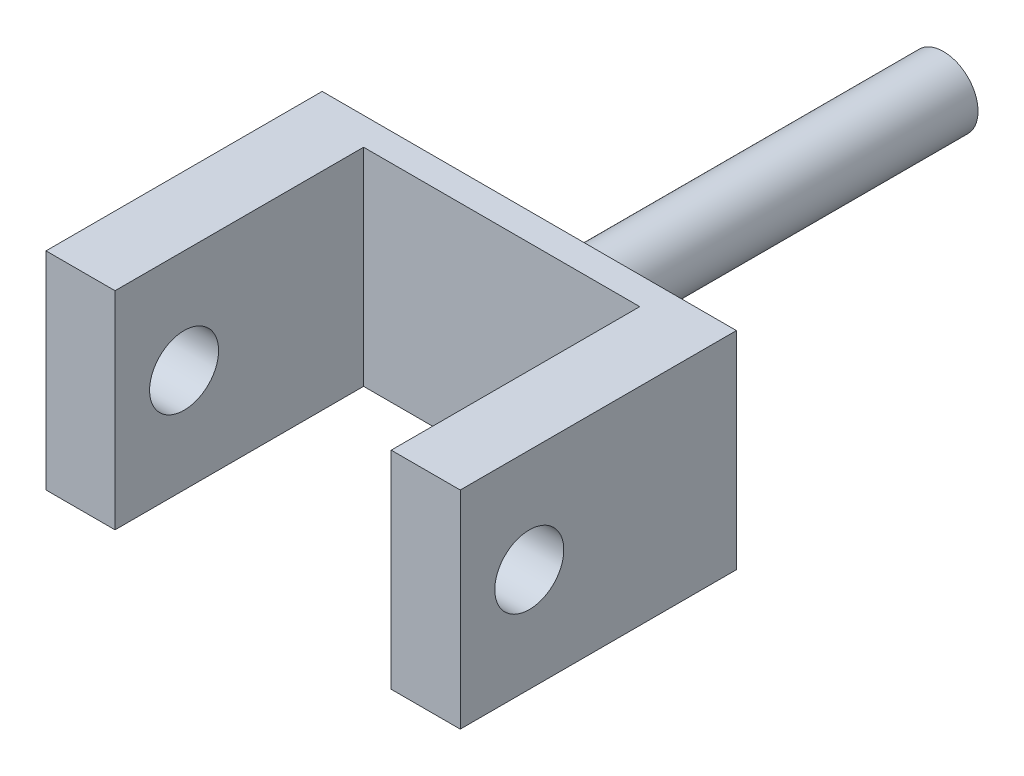
ISO-10303-21;
HEADER;
FILE_DESCRIPTION(('STEP AP214'),'2;1');
FILE_NAME('part.step','',(''),(''),'','','');
FILE_SCHEMA(('AUTOMOTIVE_DESIGN { 1 0 10303 214 1 1 1 1 }'));
ENDSEC;
DATA;
#1=APPLICATION_CONTEXT('core data for automotive mechanical design processes');
#2=APPLICATION_PROTOCOL_DEFINITION('international standard','automotive_design',2000,#1);
#3=PRODUCT_CONTEXT('',#1,'mechanical');
#4=PRODUCT('Part','Part','',(#3));
#5=PRODUCT_RELATED_PRODUCT_CATEGORY('part','',(#4));
#6=PRODUCT_DEFINITION_FORMATION('','',#4);
#7=PRODUCT_DEFINITION_CONTEXT('part definition',#1,'design');
#8=PRODUCT_DEFINITION('design','',#6,#7);
#9=PRODUCT_DEFINITION_SHAPE('','',#8);
#10=(LENGTH_UNIT() NAMED_UNIT(*) SI_UNIT(.MILLI.,.METRE.));
#11=(NAMED_UNIT(*) PLANE_ANGLE_UNIT() SI_UNIT($,.RADIAN.));
#12=(NAMED_UNIT(*) SI_UNIT($,.STERADIAN.) SOLID_ANGLE_UNIT());
#13=UNCERTAINTY_MEASURE_WITH_UNIT(LENGTH_MEASURE(1.E-05),#10,'distance_accuracy_value','');
#14=(GEOMETRIC_REPRESENTATION_CONTEXT(3) GLOBAL_UNCERTAINTY_ASSIGNED_CONTEXT((#13)) GLOBAL_UNIT_ASSIGNED_CONTEXT((#10,
#11,#12)) REPRESENTATION_CONTEXT('',''));
#15=CARTESIAN_POINT('',(0.,0.,0.));
#16=DIRECTION('',(0.,0.,1.));
#17=DIRECTION('',(1.,0.,0.));
#18=AXIS2_PLACEMENT_3D('',#15,#16,#17);
#19=CARTESIAN_POINT('',(-150.,150.,100.));
#20=DIRECTION('',(1.,0.,0.));
#21=DIRECTION('',(0.,0.,-1.));
#22=AXIS2_PLACEMENT_3D('',#19,#20,#21);
#23=PLANE('',#22);
#24=CARTESIAN_POINT('',(-150.,75.,50.0000000000001));
#25=DIRECTION('',(-1.,0.,0.));
#26=DIRECTION('',(0.,0.,1.));
#27=AXIS2_PLACEMENT_3D('',#24,#25,#26);
#28=CIRCLE('',#27,25.);
#29=CARTESIAN_POINT('',(-150.,75.,75.0000000000001));
#30=VERTEX_POINT('',#29);
#31=EDGE_CURVE('E191',#30,#30,#28,.T.);
#32=ORIENTED_EDGE('',*,*,#31,.F.);
#33=EDGE_LOOP('',(#32));
#34=FACE_BOUND('',#33,.T.);
#35=DIRECTION('',(0.,0.,1.));
#36=VECTOR('',#35,1.);
#37=CARTESIAN_POINT('',(-150.,0.,100.));
#38=LINE('',#37,#36);
#39=CARTESIAN_POINT('',(-150.,0.,-100.));
#40=VERTEX_POINT('',#39);
#41=CARTESIAN_POINT('',(-150.,0.,100.));
#42=VERTEX_POINT('',#41);
#43=EDGE_CURVE('E131',#40,#42,#38,.T.);
#44=ORIENTED_EDGE('',*,*,#43,.T.);
#45=DIRECTION('',(0.,-1.,0.));
#46=VECTOR('',#45,1.);
#47=CARTESIAN_POINT('',(-150.,150.,100.));
#48=LINE('',#47,#46);
#49=CARTESIAN_POINT('',(-150.,150.,100.));
#50=VERTEX_POINT('',#49);
#51=EDGE_CURVE('E36',#50,#42,#48,.T.);
#52=ORIENTED_EDGE('',*,*,#51,.F.);
#53=DIRECTION('',(0.,0.,1.));
#54=VECTOR('',#53,1.);
#55=CARTESIAN_POINT('',(-150.,150.,100.));
#56=LINE('',#55,#54);
#57=CARTESIAN_POINT('',(-150.,150.,-100.));
#58=VERTEX_POINT('',#57);
#59=EDGE_CURVE('E146',#58,#50,#56,.T.);
#60=ORIENTED_EDGE('',*,*,#59,.F.);
#61=DIRECTION('',(0.,-1.,0.));
#62=VECTOR('',#61,1.);
#63=CARTESIAN_POINT('',(-150.,150.,-100.));
#64=LINE('',#63,#62);
#65=EDGE_CURVE('E127',#58,#40,#64,.T.);
#66=ORIENTED_EDGE('',*,*,#65,.T.);
#67=EDGE_LOOP('',(#44,#52,#60,#66));
#68=FACE_BOUND('',#67,.T.);
#69=ADVANCED_FACE('F33',(#34,#68),#23,.F.);
#70=CARTESIAN_POINT('',(-99.9999999999999,150.,100.));
#71=DIRECTION('',(0.,0.,-1.));
#72=DIRECTION('',(-1.,0.,0.));
#73=AXIS2_PLACEMENT_3D('',#70,#71,#72);
#74=PLANE('',#73);
#75=DIRECTION('',(1.,0.,0.));
#76=VECTOR('',#75,1.);
#77=CARTESIAN_POINT('',(-99.9999999999999,0.,100.));
#78=LINE('',#77,#76);
#79=CARTESIAN_POINT('',(-99.9999999999999,0.,100.));
#80=VERTEX_POINT('',#79);
#81=EDGE_CURVE('E134',#42,#80,#78,.T.);
#82=ORIENTED_EDGE('',*,*,#81,.T.);
#83=DIRECTION('',(0.,-1.,0.));
#84=VECTOR('',#83,1.);
#85=CARTESIAN_POINT('',(-99.9999999999999,150.,100.));
#86=LINE('',#85,#84);
#87=CARTESIAN_POINT('',(-99.9999999999999,150.,100.));
#88=VERTEX_POINT('',#87);
#89=EDGE_CURVE('E155',#88,#80,#86,.T.);
#90=ORIENTED_EDGE('',*,*,#89,.F.);
#91=DIRECTION('',(1.,0.,0.));
#92=VECTOR('',#91,1.);
#93=CARTESIAN_POINT('',(-99.9999999999999,150.,100.));
#94=LINE('',#93,#92);
#95=EDGE_CURVE('E94',#50,#88,#94,.T.);
#96=ORIENTED_EDGE('',*,*,#95,.F.);
#97=ORIENTED_EDGE('',*,*,#51,.T.);
#98=EDGE_LOOP('',(#82,#90,#96,#97));
#99=FACE_BOUND('',#98,.T.);
#100=ADVANCED_FACE('F161',(#99),#74,.F.);
#101=CARTESIAN_POINT('',(-99.9999999999999,150.,100.));
#102=DIRECTION('',(-1.,0.,0.));
#103=DIRECTION('',(0.,0.,1.));
#104=AXIS2_PLACEMENT_3D('',#101,#102,#103);
#105=PLANE('',#104);
#106=CARTESIAN_POINT('',(-99.9999999999999,75.,50.0000000000001));
#107=DIRECTION('',(-1.,0.,0.));
#108=DIRECTION('',(0.,0.,1.));
#109=AXIS2_PLACEMENT_3D('',#106,#107,#108);
#110=CIRCLE('',#109,25.);
#111=CARTESIAN_POINT('',(-99.9999999999999,75.,75.0000000000001));
#112=VERTEX_POINT('',#111);
#113=EDGE_CURVE('E184',#112,#112,#110,.T.);
#114=ORIENTED_EDGE('',*,*,#113,.T.);
#115=EDGE_LOOP('',(#114));
#116=FACE_BOUND('',#115,.T.);
#117=DIRECTION('',(0.,0.,-1.));
#118=VECTOR('',#117,1.);
#119=CARTESIAN_POINT('',(-99.9999999999999,0.,100.));
#120=LINE('',#119,#118);
#121=CARTESIAN_POINT('',(-99.9999999999999,0.,-80.));
#122=VERTEX_POINT('',#121);
#123=EDGE_CURVE('E137',#80,#122,#120,.T.);
#124=ORIENTED_EDGE('',*,*,#123,.T.);
#125=DIRECTION('',(0.,-1.,0.));
#126=VECTOR('',#125,1.);
#127=CARTESIAN_POINT('',(-99.9999999999999,150.,-80.));
#128=LINE('',#127,#126);
#129=CARTESIAN_POINT('',(-99.9999999999999,150.,-80.));
#130=VERTEX_POINT('',#129);
#131=EDGE_CURVE('E153',#130,#122,#128,.T.);
#132=ORIENTED_EDGE('',*,*,#131,.F.);
#133=DIRECTION('',(0.,0.,-1.));
#134=VECTOR('',#133,1.);
#135=CARTESIAN_POINT('',(-99.9999999999999,150.,100.));
#136=LINE('',#135,#134);
#137=EDGE_CURVE('E176',#88,#130,#136,.T.);
#138=ORIENTED_EDGE('',*,*,#137,.F.);
#139=ORIENTED_EDGE('',*,*,#89,.T.);
#140=EDGE_LOOP('',(#124,#132,#138,#139));
#141=FACE_BOUND('',#140,.T.);
#142=ADVANCED_FACE('F170',(#116,#141),#105,.F.);
#143=CARTESIAN_POINT('',(-99.9999999999999,150.,-80.));
#144=DIRECTION('',(0.,0.,-1.));
#145=DIRECTION('',(-1.,0.,0.));
#146=AXIS2_PLACEMENT_3D('',#143,#144,#145);
#147=PLANE('',#146);
#148=DIRECTION('',(1.,0.,0.));
#149=VECTOR('',#148,1.);
#150=CARTESIAN_POINT('',(-99.9999999999999,0.,-80.));
#151=LINE('',#150,#149);
#152=CARTESIAN_POINT('',(100.,0.,-80.));
#153=VERTEX_POINT('',#152);
#154=EDGE_CURVE('E139',#122,#153,#151,.T.);
#155=ORIENTED_EDGE('',*,*,#154,.T.);
#156=DIRECTION('',(0.,-1.,0.));
#157=VECTOR('',#156,1.);
#158=CARTESIAN_POINT('',(100.,150.,-80.));
#159=LINE('',#158,#157);
#160=CARTESIAN_POINT('',(100.,150.,-80.));
#161=VERTEX_POINT('',#160);
#162=EDGE_CURVE('E150',#161,#153,#159,.T.);
#163=ORIENTED_EDGE('',*,*,#162,.F.);
#164=DIRECTION('',(1.,0.,0.));
#165=VECTOR('',#164,1.);
#166=CARTESIAN_POINT('',(-99.9999999999999,150.,-80.));
#167=LINE('',#166,#165);
#168=EDGE_CURVE('E175',#130,#161,#167,.T.);
#169=ORIENTED_EDGE('',*,*,#168,.F.);
#170=ORIENTED_EDGE('',*,*,#131,.T.);
#171=EDGE_LOOP('',(#155,#163,#169,#170));
#172=FACE_BOUND('',#171,.T.);
#173=ADVANCED_FACE('F173',(#172),#147,.F.);
#174=CARTESIAN_POINT('',(100.,150.,100.));
#175=DIRECTION('',(1.,0.,0.));
#176=DIRECTION('',(0.,0.,-1.));
#177=AXIS2_PLACEMENT_3D('',#174,#175,#176);
#178=PLANE('',#177);
#179=CARTESIAN_POINT('',(100.,75.,50.0000000000001));
#180=DIRECTION('',(1.,0.,0.));
#181=DIRECTION('',(0.,0.,-1.));
#182=AXIS2_PLACEMENT_3D('',#179,#180,#181);
#183=CIRCLE('',#182,25.);
#184=CARTESIAN_POINT('',(100.,75.,25.0000000000001));
#185=VERTEX_POINT('',#184);
#186=EDGE_CURVE('E187',#185,#185,#183,.T.);
#187=ORIENTED_EDGE('',*,*,#186,.T.);
#188=EDGE_LOOP('',(#187));
#189=FACE_BOUND('',#188,.T.);
#190=DIRECTION('',(0.,0.,1.));
#191=VECTOR('',#190,1.);
#192=CARTESIAN_POINT('',(100.,0.,100.));
#193=LINE('',#192,#191);
#194=CARTESIAN_POINT('',(100.,0.,100.));
#195=VERTEX_POINT('',#194);
#196=EDGE_CURVE('E141',#153,#195,#193,.T.);
#197=ORIENTED_EDGE('',*,*,#196,.T.);
#198=DIRECTION('',(0.,-1.,0.));
#199=VECTOR('',#198,1.);
#200=CARTESIAN_POINT('',(100.,150.,100.));
#201=LINE('',#200,#199);
#202=CARTESIAN_POINT('',(100.,150.,100.));
#203=VERTEX_POINT('',#202);
#204=EDGE_CURVE('E122',#203,#195,#201,.T.);
#205=ORIENTED_EDGE('',*,*,#204,.F.);
#206=DIRECTION('',(0.,0.,1.));
#207=VECTOR('',#206,1.);
#208=CARTESIAN_POINT('',(100.,150.,100.));
#209=LINE('',#208,#207);
#210=EDGE_CURVE('E113',#161,#203,#209,.T.);
#211=ORIENTED_EDGE('',*,*,#210,.F.);
#212=ORIENTED_EDGE('',*,*,#162,.T.);
#213=EDGE_LOOP('',(#197,#205,#211,#212));
#214=FACE_BOUND('',#213,.T.);
#215=ADVANCED_FACE('F206',(#189,#214),#178,.F.);
#216=CARTESIAN_POINT('',(150.,150.,100.));
#217=DIRECTION('',(0.,0.,-1.));
#218=DIRECTION('',(-1.,0.,0.));
#219=AXIS2_PLACEMENT_3D('',#216,#217,#218);
#220=PLANE('',#219);
#221=DIRECTION('',(1.,0.,0.));
#222=VECTOR('',#221,1.);
#223=CARTESIAN_POINT('',(150.,0.,100.));
#224=LINE('',#223,#222);
#225=CARTESIAN_POINT('',(150.,0.,100.));
#226=VERTEX_POINT('',#225);
#227=EDGE_CURVE('E121',#195,#226,#224,.T.);
#228=ORIENTED_EDGE('',*,*,#227,.T.);
#229=DIRECTION('',(0.,-1.,0.));
#230=VECTOR('',#229,1.);
#231=CARTESIAN_POINT('',(150.,150.,100.));
#232=LINE('',#231,#230);
#233=CARTESIAN_POINT('',(150.,150.,100.));
#234=VERTEX_POINT('',#233);
#235=EDGE_CURVE('E118',#234,#226,#232,.T.);
#236=ORIENTED_EDGE('',*,*,#235,.F.);
#237=DIRECTION('',(1.,0.,0.));
#238=VECTOR('',#237,1.);
#239=CARTESIAN_POINT('',(150.,150.,100.));
#240=LINE('',#239,#238);
#241=EDGE_CURVE('E107',#203,#234,#240,.T.);
#242=ORIENTED_EDGE('',*,*,#241,.F.);
#243=ORIENTED_EDGE('',*,*,#204,.T.);
#244=EDGE_LOOP('',(#228,#236,#242,#243));
#245=FACE_BOUND('',#244,.T.);
#246=ADVANCED_FACE('F119',(#245),#220,.F.);
#247=CARTESIAN_POINT('',(150.,150.,100.));
#248=DIRECTION('',(-1.,0.,0.));
#249=DIRECTION('',(0.,0.,1.));
#250=AXIS2_PLACEMENT_3D('',#247,#248,#249);
#251=PLANE('',#250);
#252=CARTESIAN_POINT('',(150.,75.,50.0000000000001));
#253=DIRECTION('',(-1.,0.,0.));
#254=DIRECTION('',(0.,0.,1.));
#255=AXIS2_PLACEMENT_3D('',#252,#253,#254);
#256=CIRCLE('',#255,25.);
#257=CARTESIAN_POINT('',(150.,75.,75.0000000000001));
#258=VERTEX_POINT('',#257);
#259=EDGE_CURVE('E190',#258,#258,#256,.T.);
#260=ORIENTED_EDGE('',*,*,#259,.T.);
#261=EDGE_LOOP('',(#260));
#262=FACE_BOUND('',#261,.T.);
#263=DIRECTION('',(0.,0.,-1.));
#264=VECTOR('',#263,1.);
#265=CARTESIAN_POINT('',(150.,0.,100.));
#266=LINE('',#265,#264);
#267=CARTESIAN_POINT('',(150.,0.,-100.));
#268=VERTEX_POINT('',#267);
#269=EDGE_CURVE('E79',#226,#268,#266,.T.);
#270=ORIENTED_EDGE('',*,*,#269,.T.);
#271=DIRECTION('',(0.,-1.,0.));
#272=VECTOR('',#271,1.);
#273=CARTESIAN_POINT('',(150.,150.,-100.));
#274=LINE('',#273,#272);
#275=CARTESIAN_POINT('',(150.,150.,-100.));
#276=VERTEX_POINT('',#275);
#277=EDGE_CURVE('E123',#276,#268,#274,.T.);
#278=ORIENTED_EDGE('',*,*,#277,.F.);
#279=DIRECTION('',(0.,0.,-1.));
#280=VECTOR('',#279,1.);
#281=CARTESIAN_POINT('',(150.,150.,100.));
#282=LINE('',#281,#280);
#283=EDGE_CURVE('E111',#234,#276,#282,.T.);
#284=ORIENTED_EDGE('',*,*,#283,.F.);
#285=ORIENTED_EDGE('',*,*,#235,.T.);
#286=EDGE_LOOP('',(#270,#278,#284,#285));
#287=FACE_BOUND('',#286,.T.);
#288=ADVANCED_FACE('F125',(#262,#287),#251,.F.);
#289=CARTESIAN_POINT('',(150.,150.,-100.));
#290=DIRECTION('',(0.,0.,1.));
#291=DIRECTION('',(1.,0.,0.));
#292=AXIS2_PLACEMENT_3D('',#289,#290,#291);
#293=PLANE('',#292);
#294=CARTESIAN_POINT('',(0.,75.,-100.));
#295=DIRECTION('',(0.,0.,-1.));
#296=DIRECTION('',(-1.,0.,0.));
#297=AXIS2_PLACEMENT_3D('',#294,#295,#296);
#298=CIRCLE('',#297,25.);
#299=CARTESIAN_POINT('',(-25.,75.,-100.));
#300=VERTEX_POINT('',#299);
#301=EDGE_CURVE('E11',#300,#300,#298,.T.);
#302=ORIENTED_EDGE('',*,*,#301,.F.);
#303=EDGE_LOOP('',(#302));
#304=FACE_BOUND('',#303,.T.);
#305=DIRECTION('',(-1.,0.,0.));
#306=VECTOR('',#305,1.);
#307=CARTESIAN_POINT('',(150.,0.,-100.));
#308=LINE('',#307,#306);
#309=EDGE_CURVE('E85',#268,#40,#308,.T.);
#310=ORIENTED_EDGE('',*,*,#309,.T.);
#311=ORIENTED_EDGE('',*,*,#65,.F.);
#312=DIRECTION('',(-1.,0.,0.));
#313=VECTOR('',#312,1.);
#314=CARTESIAN_POINT('',(150.,150.,-100.));
#315=LINE('',#314,#313);
#316=EDGE_CURVE('E50',#276,#58,#315,.T.);
#317=ORIENTED_EDGE('',*,*,#316,.F.);
#318=ORIENTED_EDGE('',*,*,#277,.T.);
#319=EDGE_LOOP('',(#310,#311,#317,#318));
#320=FACE_BOUND('',#319,.T.);
#321=ADVANCED_FACE('F257',(#304,#320),#293,.F.);
#322=CARTESIAN_POINT('',(0.,150.,0.));
#323=DIRECTION('',(0.,1.,0.));
#324=DIRECTION('',(0.,0.,1.));
#325=AXIS2_PLACEMENT_3D('',#322,#323,#324);
#326=PLANE('',#325);
#327=ORIENTED_EDGE('',*,*,#59,.T.);
#328=ORIENTED_EDGE('',*,*,#95,.T.);
#329=ORIENTED_EDGE('',*,*,#137,.T.);
#330=ORIENTED_EDGE('',*,*,#168,.T.);
#331=ORIENTED_EDGE('',*,*,#210,.T.);
#332=ORIENTED_EDGE('',*,*,#241,.T.);
#333=ORIENTED_EDGE('',*,*,#283,.T.);
#334=ORIENTED_EDGE('',*,*,#316,.T.);
#335=EDGE_LOOP('',(#327,#328,#329,#330,#331,#332,#333,#334));
#336=FACE_BOUND('',#335,.T.);
#337=ADVANCED_FACE('F109',(#336),#326,.T.);
#338=CARTESIAN_POINT('',(0.,0.,0.));
#339=DIRECTION('',(0.,1.,0.));
#340=DIRECTION('',(0.,0.,1.));
#341=AXIS2_PLACEMENT_3D('',#338,#339,#340);
#342=PLANE('',#341);
#343=ORIENTED_EDGE('',*,*,#43,.F.);
#344=ORIENTED_EDGE('',*,*,#309,.F.);
#345=ORIENTED_EDGE('',*,*,#269,.F.);
#346=ORIENTED_EDGE('',*,*,#227,.F.);
#347=ORIENTED_EDGE('',*,*,#196,.F.);
#348=ORIENTED_EDGE('',*,*,#154,.F.);
#349=ORIENTED_EDGE('',*,*,#123,.F.);
#350=ORIENTED_EDGE('',*,*,#81,.F.);
#351=EDGE_LOOP('',(#343,#344,#345,#346,#347,#348,#349,#350));
#352=FACE_BOUND('',#351,.T.);
#353=ADVANCED_FACE('F166',(#352),#342,.F.);
#354=CARTESIAN_POINT('',(0.,75.,-400.));
#355=DIRECTION('',(0.,0.,1.));
#356=DIRECTION('',(1.,0.,0.));
#357=AXIS2_PLACEMENT_3D('',#354,#355,#356);
#358=CYLINDRICAL_SURFACE('',#357,25.);
#359=CARTESIAN_POINT('',(0.,75.,-400.));
#360=DIRECTION('',(0.,0.,-1.));
#361=DIRECTION('',(-1.,0.,0.));
#362=AXIS2_PLACEMENT_3D('',#359,#360,#361);
#363=CIRCLE('',#362,25.);
#364=CARTESIAN_POINT('',(-25.,75.,-400.));
#365=VERTEX_POINT('',#364);
#366=EDGE_CURVE('E135',#365,#365,#363,.T.);
#367=ORIENTED_EDGE('',*,*,#366,.F.);
#368=EDGE_LOOP('',(#367));
#369=FACE_BOUND('',#368,.T.);
#370=ORIENTED_EDGE('',*,*,#301,.T.);
#371=EDGE_LOOP('',(#370));
#372=FACE_BOUND('',#371,.T.);
#373=ADVANCED_FACE('F268',(#369,#372),#358,.T.);
#374=CARTESIAN_POINT('',(0.,75.,-400.));
#375=DIRECTION('',(0.,0.,-1.));
#376=DIRECTION('',(-1.,0.,0.));
#377=AXIS2_PLACEMENT_3D('',#374,#375,#376);
#378=PLANE('',#377);
#379=ORIENTED_EDGE('',*,*,#366,.T.);
#380=EDGE_LOOP('',(#379));
#381=FACE_BOUND('',#380,.T.);
#382=ADVANCED_FACE('F202',(#381),#378,.T.);
#383=CARTESIAN_POINT('',(150.,75.,50.0000000000001));
#384=DIRECTION('',(-1.,0.,0.));
#385=DIRECTION('',(0.,0.,1.));
#386=AXIS2_PLACEMENT_3D('',#383,#384,#385);
#387=CYLINDRICAL_SURFACE('',#386,25.);
#388=ORIENTED_EDGE('',*,*,#259,.F.);
#389=EDGE_LOOP('',(#388));
#390=FACE_BOUND('',#389,.T.);
#391=ORIENTED_EDGE('',*,*,#186,.F.);
#392=EDGE_LOOP('',(#391));
#393=FACE_BOUND('',#392,.T.);
#394=ADVANCED_FACE('F198',(#390,#393),#387,.F.);
#395=ORIENTED_EDGE('',*,*,#31,.T.);
#396=EDGE_LOOP('',(#395));
#397=FACE_BOUND('',#396,.T.);
#398=ORIENTED_EDGE('',*,*,#113,.F.);
#399=EDGE_LOOP('',(#398));
#400=FACE_BOUND('',#399,.T.);
#401=ADVANCED_FACE('F201',(#397,#400),#387,.F.);
#402=CLOSED_SHELL('',(#69,#100,#142,#173,#215,#246,#288,#321,#337,#353,#373,#382,#394,#401));
#403=MANIFOLD_SOLID_BREP('B2',#402);
#404=ADVANCED_BREP_SHAPE_REPRESENTATION('',(#18,#403),#14);
#405=SHAPE_DEFINITION_REPRESENTATION(#9,#404);
ENDSEC;
END-ISO-10303-21;
